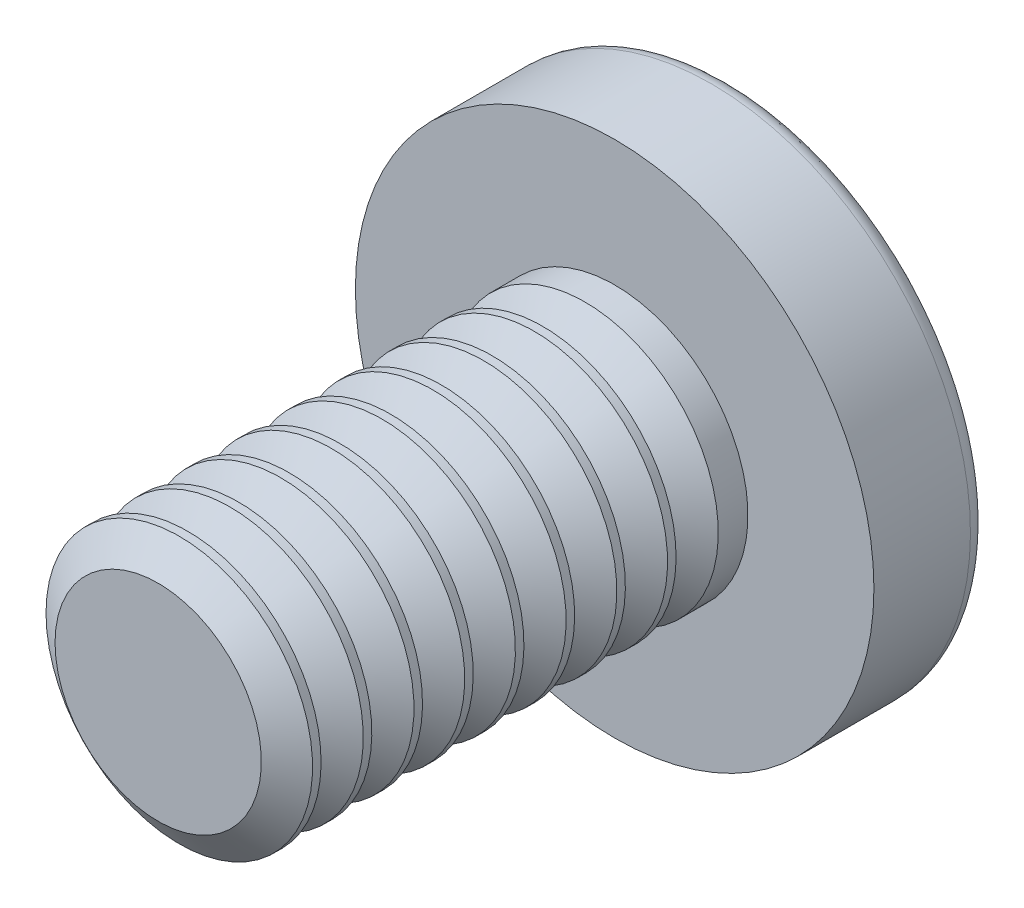
ISO-10303-21;
HEADER;
FILE_DESCRIPTION(('STEP AP214'),'2;1');
FILE_NAME('part.step','',(''),(''),'','','');
FILE_SCHEMA(('AUTOMOTIVE_DESIGN { 1 0 10303 214 1 1 1 1 }'));
ENDSEC;
DATA;
#1=APPLICATION_CONTEXT('core data for automotive mechanical design processes');
#2=APPLICATION_PROTOCOL_DEFINITION('international standard','automotive_design',2000,#1);
#3=PRODUCT_CONTEXT('',#1,'mechanical');
#4=PRODUCT('Part','Part','',(#3));
#5=PRODUCT_RELATED_PRODUCT_CATEGORY('part','',(#4));
#6=PRODUCT_DEFINITION_FORMATION('','',#4);
#7=PRODUCT_DEFINITION_CONTEXT('part definition',#1,'design');
#8=PRODUCT_DEFINITION('design','',#6,#7);
#9=PRODUCT_DEFINITION_SHAPE('','',#8);
#10=(LENGTH_UNIT() NAMED_UNIT(*) SI_UNIT(.MILLI.,.METRE.));
#11=(NAMED_UNIT(*) PLANE_ANGLE_UNIT() SI_UNIT($,.RADIAN.));
#12=(NAMED_UNIT(*) SI_UNIT($,.STERADIAN.) SOLID_ANGLE_UNIT());
#13=UNCERTAINTY_MEASURE_WITH_UNIT(LENGTH_MEASURE(1.E-05),#10,'distance_accuracy_value','');
#14=(GEOMETRIC_REPRESENTATION_CONTEXT(3) GLOBAL_UNCERTAINTY_ASSIGNED_CONTEXT((#13)) GLOBAL_UNIT_ASSIGNED_CONTEXT((#10,
#11,#12)) REPRESENTATION_CONTEXT('',''));
#15=CARTESIAN_POINT('',(0.,0.,0.));
#16=DIRECTION('',(0.,0.,1.));
#17=DIRECTION('',(1.,0.,0.));
#18=AXIS2_PLACEMENT_3D('',#15,#16,#17);
#19=CARTESIAN_POINT('',(15.7814883501429,22.9304884918168,-0.938722603143375));
#20=DIRECTION('',(0.,0.,1.));
#21=DIRECTION('',(1.,0.,0.));
#22=AXIS2_PLACEMENT_3D('',#19,#20,#21);
#23=PLANE('',#22);
#24=CARTESIAN_POINT('',(16.706385111808,22.9943664243214,-0.938722603150306));
#25=DIRECTION('',(0.,0.,-1.));
#26=DIRECTION('',(-1.,0.,0.));
#27=AXIS2_PLACEMENT_3D('',#24,#25,#26);
#28=CIRCLE('',#27,0.717549999978716);
#29=CARTESIAN_POINT('',(15.9888351118293,22.9943664243214,-0.938722603150305));
#30=VERTEX_POINT('',#29);
#31=EDGE_CURVE('E20',#30,#30,#28,.T.);
#32=ORIENTED_EDGE('',*,*,#31,.F.);
#33=EDGE_LOOP('',(#32));
#34=FACE_BOUND('',#33,.T.);
#35=ADVANCED_FACE('F17',(#34),#23,.T.);
#36=CARTESIAN_POINT('',(16.706385111808,22.9943664243214,-1.08545109287661));
#37=DIRECTION('',(0.,0.,-1.));
#38=DIRECTION('',(-1.,0.,0.));
#39=AXIS2_PLACEMENT_3D('',#36,#37,#38);
#40=CONICAL_SURFACE('',#39,0.92710000013191,0.959931088637895);
#41=CARTESIAN_POINT('',(16.7063851118081,22.9943664243214,-1.08545109277522));
#42=DIRECTION('',(0.,0.,-1.));
#43=DIRECTION('',(-1.,0.,0.));
#44=AXIS2_PLACEMENT_3D('',#41,#42,#43);
#45=CIRCLE('',#44,0.9271);
#46=CARTESIAN_POINT('',(15.7792851118081,22.9943664243214,-1.08545109277522));
#47=VERTEX_POINT('',#46);
#48=EDGE_CURVE('E223',#47,#47,#45,.T.);
#49=ORIENTED_EDGE('',*,*,#48,.F.);
#50=EDGE_LOOP('',(#49));
#51=FACE_BOUND('',#50,.T.);
#52=ORIENTED_EDGE('',*,*,#31,.T.);
#53=EDGE_LOOP('',(#52));
#54=FACE_BOUND('',#53,.T.);
#55=ADVANCED_FACE('F767',(#51,#54),#40,.T.);
#56=CARTESIAN_POINT('',(16.706385111808,22.9943664243214,-30.8599226031433));
#57=DIRECTION('',(0.,0.,-1.));
#58=DIRECTION('',(-1.,0.,0.));
#59=AXIS2_PLACEMENT_3D('',#56,#57,#58);
#60=CYLINDRICAL_SURFACE('',#59,0.9271);
#61=CARTESIAN_POINT('',(16.706385111808,22.9943664243214,-1.14473661358261));
#62=DIRECTION('',(0.,0.,1.));
#63=DIRECTION('',(-0.997623515980897,-0.0689008008800587,0.));
#64=AXIS2_PLACEMENT_3D('',#61,#62,#63);
#65=CIRCLE('',#64,0.927100000027563);
#66=CARTESIAN_POINT('',(15.7814883501146,22.9304884918236,-1.14473661358261));
#67=VERTEX_POINT('',#66);
#68=EDGE_CURVE('E220',#67,#67,#65,.F.);
#69=ORIENTED_EDGE('',*,*,#68,.F.);
#70=EDGE_LOOP('',(#69));
#71=FACE_BOUND('',#70,.T.);
#72=ORIENTED_EDGE('',*,*,#48,.T.);
#73=EDGE_LOOP('',(#72));
#74=FACE_BOUND('',#73,.T.);
#75=ADVANCED_FACE('F757',(#71,#74),#60,.T.);
#76=CARTESIAN_POINT('',(16.706385111808,22.9943664243214,-1.14473661358261));
#77=DIRECTION('',(0.,0.,1.));
#78=DIRECTION('',(0.,-1.,0.));
#79=AXIS2_PLACEMENT_3D('',#76,#77,#78);
#80=CONICAL_SURFACE('',#79,0.927100000027563,0.959931088618292);
#81=CARTESIAN_POINT('',(16.706385111808,22.9943664243214,-1.29146510312239));
#82=DIRECTION('',(0.,0.,-1.));
#83=DIRECTION('',(0.997623515980567,0.068900800884834,0.));
#84=AXIS2_PLACEMENT_3D('',#81,#82,#83);
#85=CIRCLE('',#84,0.717550000001558);
#86=CARTESIAN_POINT('',(17.4222298657014,23.0438061939964,-1.29146510312239));
#87=VERTEX_POINT('',#86);
#88=EDGE_CURVE('E217',#87,#87,#85,.T.);
#89=ORIENTED_EDGE('',*,*,#88,.F.);
#90=EDGE_LOOP('',(#89));
#91=FACE_BOUND('',#90,.T.);
#92=ORIENTED_EDGE('',*,*,#68,.T.);
#93=EDGE_LOOP('',(#92));
#94=FACE_BOUND('',#93,.T.);
#95=ADVANCED_FACE('F747',(#91,#94),#80,.T.);
#96=CARTESIAN_POINT('',(16.706385111808,22.9943664243214,-1.4381935928327));
#97=DIRECTION('',(0.,0.,-1.));
#98=DIRECTION('',(-1.,0.,0.));
#99=AXIS2_PLACEMENT_3D('',#96,#97,#98);
#100=CONICAL_SURFACE('',#99,0.927100000131913,0.959931088637895);
#101=ORIENTED_EDGE('',*,*,#88,.T.);
#102=EDGE_LOOP('',(#101));
#103=FACE_BOUND('',#102,.T.);
#104=CARTESIAN_POINT('',(16.7063851118081,22.9943664243214,-1.43819359277522));
#105=DIRECTION('',(0.,0.,-1.));
#106=DIRECTION('',(-1.,0.,0.));
#107=AXIS2_PLACEMENT_3D('',#104,#105,#106);
#108=CIRCLE('',#107,0.9271);
#109=CARTESIAN_POINT('',(15.7792851118081,22.9943664243214,-1.43819359277522));
#110=VERTEX_POINT('',#109);
#111=EDGE_CURVE('E214',#110,#110,#108,.T.);
#112=ORIENTED_EDGE('',*,*,#111,.F.);
#113=EDGE_LOOP('',(#112));
#114=FACE_BOUND('',#113,.T.);
#115=ADVANCED_FACE('F737',(#103,#114),#100,.T.);
#116=CARTESIAN_POINT('',(16.706385111808,22.9943664243214,-30.8599226031433));
#117=DIRECTION('',(0.,0.,-1.));
#118=DIRECTION('',(-1.,0.,0.));
#119=AXIS2_PLACEMENT_3D('',#116,#117,#118);
#120=CYLINDRICAL_SURFACE('',#119,0.9271);
#121=ORIENTED_EDGE('',*,*,#111,.T.);
#122=EDGE_LOOP('',(#121));
#123=FACE_BOUND('',#122,.T.);
#124=CARTESIAN_POINT('',(16.706385111808,22.9943664243214,-1.49747911359555));
#125=DIRECTION('',(0.,0.,1.));
#126=DIRECTION('',(-0.997623515980894,-0.0689008008801036,0.));
#127=AXIS2_PLACEMENT_3D('',#124,#125,#126);
#128=CIRCLE('',#127,0.927100000027615);
#129=CARTESIAN_POINT('',(15.7814883501146,22.9304884918236,-1.49747911359555));
#130=VERTEX_POINT('',#129);
#131=EDGE_CURVE('E211',#130,#130,#128,.F.);
#132=ORIENTED_EDGE('',*,*,#131,.F.);
#133=EDGE_LOOP('',(#132));
#134=FACE_BOUND('',#133,.T.);
#135=ADVANCED_FACE('F727',(#123,#134),#120,.T.);
#136=CARTESIAN_POINT('',(16.706385111808,22.9943664243214,-1.49747911359555));
#137=DIRECTION('',(0.,0.,1.));
#138=DIRECTION('',(0.,-1.,0.));
#139=AXIS2_PLACEMENT_3D('',#136,#137,#138);
#140=CONICAL_SURFACE('',#139,0.927100000027615,0.959931088618292);
#141=ORIENTED_EDGE('',*,*,#131,.T.);
#142=EDGE_LOOP('',(#141));
#143=FACE_BOUND('',#142,.T.);
#144=CARTESIAN_POINT('',(16.706385111808,22.9943664243214,-1.64420760313533));
#145=DIRECTION('',(0.,0.,-1.));
#146=DIRECTION('',(0.997623515980571,0.0689008008847761,0.));
#147=AXIS2_PLACEMENT_3D('',#144,#145,#146);
#148=CIRCLE('',#147,0.717550000001506);
#149=CARTESIAN_POINT('',(17.4222298657014,23.0438061939964,-1.64420760313533));
#150=VERTEX_POINT('',#149);
#151=EDGE_CURVE('E208',#150,#150,#148,.T.);
#152=ORIENTED_EDGE('',*,*,#151,.F.);
#153=EDGE_LOOP('',(#152));
#154=FACE_BOUND('',#153,.T.);
#155=ADVANCED_FACE('F717',(#143,#154),#140,.T.);
#156=CARTESIAN_POINT('',(16.706385111808,22.9943664243214,-1.7909360927888));
#157=DIRECTION('',(0.,0.,-1.));
#158=DIRECTION('',(-1.,0.,0.));
#159=AXIS2_PLACEMENT_3D('',#156,#157,#158);
#160=CONICAL_SURFACE('',#159,0.927100000017956,0.959931088510746);
#161=CARTESIAN_POINT('',(16.7063851118081,22.9943664243214,-1.79093609277522));
#162=DIRECTION('',(0.,0.,-1.));
#163=DIRECTION('',(-1.,0.,0.));
#164=AXIS2_PLACEMENT_3D('',#161,#162,#163);
#165=CIRCLE('',#164,0.9271);
#166=CARTESIAN_POINT('',(15.7792851118081,22.9943664243214,-1.79093609277522));
#167=VERTEX_POINT('',#166);
#168=EDGE_CURVE('E205',#167,#167,#165,.T.);
#169=ORIENTED_EDGE('',*,*,#168,.F.);
#170=EDGE_LOOP('',(#169));
#171=FACE_BOUND('',#170,.T.);
#172=ORIENTED_EDGE('',*,*,#151,.T.);
#173=EDGE_LOOP('',(#172));
#174=FACE_BOUND('',#173,.T.);
#175=ADVANCED_FACE('F707',(#171,#174),#160,.T.);
#176=CARTESIAN_POINT('',(16.706385111808,22.9943664243214,-30.8599226031433));
#177=DIRECTION('',(0.,0.,-1.));
#178=DIRECTION('',(-1.,0.,0.));
#179=AXIS2_PLACEMENT_3D('',#176,#177,#178);
#180=CYLINDRICAL_SURFACE('',#179,0.9271);
#181=CARTESIAN_POINT('',(16.706385111808,22.9943664243214,-1.8502216134948));
#182=DIRECTION('',(0.,0.,1.));
#183=DIRECTION('',(-0.997623515980606,-0.0689008008842732,0.));
#184=AXIS2_PLACEMENT_3D('',#181,#182,#183);
#185=CIRCLE('',#184,0.927099999970855);
#186=CARTESIAN_POINT('',(15.7814883501715,22.9304884918236,-1.8502216134948));
#187=VERTEX_POINT('',#186);
#188=EDGE_CURVE('E202',#187,#187,#185,.F.);
#189=ORIENTED_EDGE('',*,*,#188,.F.);
#190=EDGE_LOOP('',(#189));
#191=FACE_BOUND('',#190,.T.);
#192=ORIENTED_EDGE('',*,*,#168,.T.);
#193=EDGE_LOOP('',(#192));
#194=FACE_BOUND('',#193,.T.);
#195=ADVANCED_FACE('F697',(#191,#194),#180,.T.);
#196=CARTESIAN_POINT('',(16.706385111808,22.9943664243214,-1.85022161355164));
#197=DIRECTION('',(0.,0.,1.));
#198=DIRECTION('',(0.,-1.,0.));
#199=AXIS2_PLACEMENT_3D('',#196,#197,#198);
#200=CONICAL_SURFACE('',#199,0.927099999856948,0.959931088618292);
#201=CARTESIAN_POINT('',(16.706385111808,22.9943664243214,-1.99695010320511));
#202=DIRECTION('',(0.,0.,-1.));
#203=DIRECTION('',(0.997623515980566,0.0689008008848387,0.));
#204=AXIS2_PLACEMENT_3D('',#201,#202,#203);
#205=CIRCLE('',#204,0.717550000001509);
#206=CARTESIAN_POINT('',(17.4222298657014,23.0438061939964,-1.99695010320511));
#207=VERTEX_POINT('',#206);
#208=EDGE_CURVE('E199',#207,#207,#205,.T.);
#209=ORIENTED_EDGE('',*,*,#208,.F.);
#210=EDGE_LOOP('',(#209));
#211=FACE_BOUND('',#210,.T.);
#212=ORIENTED_EDGE('',*,*,#188,.T.);
#213=EDGE_LOOP('',(#212));
#214=FACE_BOUND('',#213,.T.);
#215=ADVANCED_FACE('F687',(#211,#214),#200,.T.);
#216=CARTESIAN_POINT('',(16.706385111808,22.9943664243214,-2.1436785926312));
#217=DIRECTION('',(0.,0.,-1.));
#218=DIRECTION('',(0.,1.,0.));
#219=AXIS2_PLACEMENT_3D('',#216,#217,#218);
#220=CONICAL_SURFACE('',#219,0.927099999733438,0.959931088491143);
#221=ORIENTED_EDGE('',*,*,#208,.T.);
#222=EDGE_LOOP('',(#221));
#223=FACE_BOUND('',#222,.T.);
#224=CARTESIAN_POINT('',(16.7063851118081,22.9943664243214,-2.14367859277522));
#225=DIRECTION('',(0.,0.,-1.));
#226=DIRECTION('',(-1.,0.,0.));
#227=AXIS2_PLACEMENT_3D('',#224,#225,#226);
#228=CIRCLE('',#227,0.9271);
#229=CARTESIAN_POINT('',(15.7792851118081,22.9943664243214,-2.14367859277522));
#230=VERTEX_POINT('',#229);
#231=EDGE_CURVE('E196',#230,#230,#228,.T.);
#232=ORIENTED_EDGE('',*,*,#231,.F.);
#233=EDGE_LOOP('',(#232));
#234=FACE_BOUND('',#233,.T.);
#235=ADVANCED_FACE('F677',(#223,#234),#220,.T.);
#236=CARTESIAN_POINT('',(16.706385111808,22.9943664243214,-30.8599226031433));
#237=DIRECTION('',(0.,0.,-1.));
#238=DIRECTION('',(-1.,0.,0.));
#239=AXIS2_PLACEMENT_3D('',#236,#237,#238);
#240=CYLINDRICAL_SURFACE('',#239,0.9271);
#241=ORIENTED_EDGE('',*,*,#231,.T.);
#242=EDGE_LOOP('',(#241));
#243=FACE_BOUND('',#242,.T.);
#244=CARTESIAN_POINT('',(16.706385111808,22.9943664243214,-2.20296411356458));
#245=DIRECTION('',(0.,0.,1.));
#246=DIRECTION('',(-0.997623515980606,-0.0689008008842696,0.));
#247=AXIS2_PLACEMENT_3D('',#244,#245,#246);
#248=CIRCLE('',#247,0.927099999970903);
#249=CARTESIAN_POINT('',(15.7814883501715,22.9304884918236,-2.20296411356458));
#250=VERTEX_POINT('',#249);
#251=EDGE_CURVE('E193',#250,#250,#248,.F.);
#252=ORIENTED_EDGE('',*,*,#251,.F.);
#253=EDGE_LOOP('',(#252));
#254=FACE_BOUND('',#253,.T.);
#255=ADVANCED_FACE('F667',(#243,#254),#240,.T.);
#256=CARTESIAN_POINT('',(16.706385111808,22.9943664243214,-2.20296411367826));
#257=DIRECTION('',(0.,0.,1.));
#258=DIRECTION('',(0.,-1.,0.));
#259=AXIS2_PLACEMENT_3D('',#256,#257,#258);
#260=CONICAL_SURFACE('',#259,0.927099999799799,0.959931088544916);
#261=ORIENTED_EDGE('',*,*,#251,.T.);
#262=EDGE_LOOP('',(#261));
#263=FACE_BOUND('',#262,.T.);
#264=CARTESIAN_POINT('',(16.706385111808,22.9943664243213,-2.34969260321805));
#265=DIRECTION('',(0.,0.,-1.));
#266=DIRECTION('',(0.997623515980562,0.068900800884911,0.));
#267=AXIS2_PLACEMENT_3D('',#264,#265,#266);
#268=CIRCLE('',#267,0.717550000001561);
#269=CARTESIAN_POINT('',(17.4222298657014,23.0438061939964,-2.34969260321805));
#270=VERTEX_POINT('',#269);
#271=EDGE_CURVE('E190',#270,#270,#268,.T.);
#272=ORIENTED_EDGE('',*,*,#271,.F.);
#273=EDGE_LOOP('',(#272));
#274=FACE_BOUND('',#273,.T.);
#275=ADVANCED_FACE('F657',(#263,#274),#260,.T.);
#276=CARTESIAN_POINT('',(16.706385111808,22.9943664243213,-2.49642109264414));
#277=DIRECTION('',(0.,0.,-1.));
#278=DIRECTION('',(0.,1.,0.));
#279=AXIS2_PLACEMENT_3D('',#276,#277,#278);
#280=CONICAL_SURFACE('',#279,0.92709999973349,0.959931088491143);
#281=CARTESIAN_POINT('',(16.7063851118081,22.9943664243214,-2.49642109277522));
#282=DIRECTION('',(0.,0.,-1.));
#283=DIRECTION('',(-1.,0.,0.));
#284=AXIS2_PLACEMENT_3D('',#281,#282,#283);
#285=CIRCLE('',#284,0.9271);
#286=CARTESIAN_POINT('',(15.7792851118081,22.9943664243214,-2.49642109277522));
#287=VERTEX_POINT('',#286);
#288=EDGE_CURVE('E187',#287,#287,#285,.T.);
#289=ORIENTED_EDGE('',*,*,#288,.F.);
#290=EDGE_LOOP('',(#289));
#291=FACE_BOUND('',#290,.T.);
#292=ORIENTED_EDGE('',*,*,#271,.T.);
#293=EDGE_LOOP('',(#292));
#294=FACE_BOUND('',#293,.T.);
#295=ADVANCED_FACE('F647',(#291,#294),#280,.T.);
#296=CARTESIAN_POINT('',(16.706385111808,22.9943664243214,-30.8599226031433));
#297=DIRECTION('',(0.,0.,-1.));
#298=DIRECTION('',(-1.,0.,0.));
#299=AXIS2_PLACEMENT_3D('',#296,#297,#298);
#300=CYLINDRICAL_SURFACE('',#299,0.9271);
#301=CARTESIAN_POINT('',(16.706385111808,22.9943664243213,-2.55570661357751));
#302=DIRECTION('',(0.,0.,1.));
#303=DIRECTION('',(-0.99762351598061,-0.0689008008842136,0.));
#304=AXIS2_PLACEMENT_3D('',#301,#302,#303);
#305=CIRCLE('',#304,0.927099999970851);
#306=CARTESIAN_POINT('',(15.7814883501715,22.9304884918236,-2.55570661357751));
#307=VERTEX_POINT('',#306);
#308=EDGE_CURVE('E184',#307,#307,#305,.F.);
#309=ORIENTED_EDGE('',*,*,#308,.F.);
#310=EDGE_LOOP('',(#309));
#311=FACE_BOUND('',#310,.T.);
#312=ORIENTED_EDGE('',*,*,#288,.T.);
#313=EDGE_LOOP('',(#312));
#314=FACE_BOUND('',#313,.T.);
#315=ADVANCED_FACE('F637',(#311,#314),#300,.T.);
#316=CARTESIAN_POINT('',(16.706385111808,22.9943664243213,-2.5557066136912));
#317=DIRECTION('',(0.,0.,1.));
#318=DIRECTION('',(0.,-1.,0.));
#319=AXIS2_PLACEMENT_3D('',#316,#317,#318);
#320=CONICAL_SURFACE('',#319,0.927099999799747,0.959931088544917);
#321=CARTESIAN_POINT('',(16.706385111808,22.9943664243214,-2.7024351031173));
#322=DIRECTION('',(0.,0.,-1.));
#323=DIRECTION('',(0.997623515980567,0.068900800884834,0.));
#324=AXIS2_PLACEMENT_3D('',#321,#322,#323);
#325=CIRCLE('',#324,0.717550000001558);
#326=CARTESIAN_POINT('',(17.4222298657014,23.0438061939964,-2.7024351031173));
#327=VERTEX_POINT('',#326);
#328=EDGE_CURVE('E181',#327,#327,#325,.T.);
#329=ORIENTED_EDGE('',*,*,#328,.F.);
#330=EDGE_LOOP('',(#329));
#331=FACE_BOUND('',#330,.T.);
#332=ORIENTED_EDGE('',*,*,#308,.T.);
#333=EDGE_LOOP('',(#332));
#334=FACE_BOUND('',#333,.T.);
#335=ADVANCED_FACE('F627',(#331,#334),#320,.T.);
#336=CARTESIAN_POINT('',(16.706385111808,22.9943664243214,-2.84916359282761));
#337=DIRECTION('',(0.,0.,-1.));
#338=DIRECTION('',(0.,1.,0.));
#339=AXIS2_PLACEMENT_3D('',#336,#337,#338);
#340=CONICAL_SURFACE('',#339,0.927100000131913,0.959931088637895);
#341=ORIENTED_EDGE('',*,*,#328,.T.);
#342=EDGE_LOOP('',(#341));
#343=FACE_BOUND('',#342,.T.);
#344=CARTESIAN_POINT('',(16.7063851118081,22.9943664243214,-2.84916359277522));
#345=DIRECTION('',(0.,0.,-1.));
#346=DIRECTION('',(-1.,0.,0.));
#347=AXIS2_PLACEMENT_3D('',#344,#345,#346);
#348=CIRCLE('',#347,0.9271);
#349=CARTESIAN_POINT('',(15.7792851118081,22.9943664243214,-2.84916359277522));
#350=VERTEX_POINT('',#349);
#351=EDGE_CURVE('E178',#350,#350,#348,.T.);
#352=ORIENTED_EDGE('',*,*,#351,.F.);
#353=EDGE_LOOP('',(#352));
#354=FACE_BOUND('',#353,.T.);
#355=ADVANCED_FACE('F617',(#343,#354),#340,.T.);
#356=CARTESIAN_POINT('',(16.706385111808,22.9943664243214,-30.8599226031433));
#357=DIRECTION('',(0.,0.,-1.));
#358=DIRECTION('',(-1.,0.,0.));
#359=AXIS2_PLACEMENT_3D('',#356,#357,#358);
#360=CYLINDRICAL_SURFACE('',#359,0.9271);
#361=ORIENTED_EDGE('',*,*,#351,.T.);
#362=EDGE_LOOP('',(#361));
#363=FACE_BOUND('',#362,.T.);
#364=CARTESIAN_POINT('',(16.706385111808,22.9943664243213,-2.90844911353361));
#365=DIRECTION('',(0.,0.,1.));
#366=DIRECTION('',(-0.997623515981192,-0.0689008008757847,0.));
#367=AXIS2_PLACEMENT_3D('',#364,#365,#366);
#368=CIRCLE('',#367,0.927100000084268);
#369=CARTESIAN_POINT('',(15.7814883500578,22.9304884918236,-2.90844911353361));
#370=VERTEX_POINT('',#369);
#371=EDGE_CURVE('E175',#370,#370,#368,.F.);
#372=ORIENTED_EDGE('',*,*,#371,.F.);
#373=EDGE_LOOP('',(#372));
#374=FACE_BOUND('',#373,.T.);
#375=ADVANCED_FACE('F607',(#363,#374),#360,.T.);
#376=CARTESIAN_POINT('',(16.706385111808,22.9943664243213,-2.90844911364729));
#377=DIRECTION('',(0.,0.,1.));
#378=DIRECTION('',(0.,-1.,0.));
#379=AXIS2_PLACEMENT_3D('',#376,#377,#378);
#380=CONICAL_SURFACE('',#379,0.927099999856945,0.959931088491143);
#381=ORIENTED_EDGE('',*,*,#371,.T.);
#382=EDGE_LOOP('',(#381));
#383=FACE_BOUND('',#382,.T.);
#384=CARTESIAN_POINT('',(16.706385111808,22.9943664243214,-3.05517760313023));
#385=DIRECTION('',(0.,0.,-1.));
#386=DIRECTION('',(0.997623515980566,0.0689008008848387,0.));
#387=AXIS2_PLACEMENT_3D('',#384,#385,#386);
#388=CIRCLE('',#387,0.717550000001509);
#389=CARTESIAN_POINT('',(17.4222298657014,23.0438061939964,-3.05517760313023));
#390=VERTEX_POINT('',#389);
#391=EDGE_CURVE('E172',#390,#390,#388,.T.);
#392=ORIENTED_EDGE('',*,*,#391,.F.);
#393=EDGE_LOOP('',(#392));
#394=FACE_BOUND('',#393,.T.);
#395=ADVANCED_FACE('F597',(#383,#394),#380,.T.);
#396=CARTESIAN_POINT('',(16.706385111808,22.9943664243214,-3.2019060927837));
#397=DIRECTION('',(0.,0.,-1.));
#398=DIRECTION('',(0.,1.,0.));
#399=AXIS2_PLACEMENT_3D('',#396,#397,#398);
#400=CONICAL_SURFACE('',#399,0.927100000017959,0.959931088564519);
#401=CARTESIAN_POINT('',(16.7063851118081,22.9943664243214,-3.20190609277522));
#402=DIRECTION('',(0.,0.,-1.));
#403=DIRECTION('',(-1.,0.,0.));
#404=AXIS2_PLACEMENT_3D('',#401,#402,#403);
#405=CIRCLE('',#404,0.9271);
#406=CARTESIAN_POINT('',(15.7792851118081,22.9943664243214,-3.20190609277522));
#407=VERTEX_POINT('',#406);
#408=EDGE_CURVE('E164',#407,#407,#405,.T.);
#409=ORIENTED_EDGE('',*,*,#408,.F.);
#410=EDGE_LOOP('',(#409));
#411=FACE_BOUND('',#410,.T.);
#412=ORIENTED_EDGE('',*,*,#391,.T.);
#413=EDGE_LOOP('',(#412));
#414=FACE_BOUND('',#413,.T.);
#415=ADVANCED_FACE('F587',(#411,#414),#400,.T.);
#416=CARTESIAN_POINT('',(16.706385111808,22.9943664243214,-30.8599226031433));
#417=DIRECTION('',(0.,0.,-1.));
#418=DIRECTION('',(-1.,0.,0.));
#419=AXIS2_PLACEMENT_3D('',#416,#417,#418);
#420=CYLINDRICAL_SURFACE('',#419,0.9271);
#421=CARTESIAN_POINT('',(16.706385111808,22.9943664243214,-3.2611916134897));
#422=DIRECTION('',(0.,0.,1.));
#423=DIRECTION('',(-0.997623515980606,-0.0689008008842696,0.));
#424=AXIS2_PLACEMENT_3D('',#421,#422,#423);
#425=CIRCLE('',#424,0.927099999970903);
#426=CARTESIAN_POINT('',(15.7814883501715,22.9304884918236,-3.2611916134897));
#427=VERTEX_POINT('',#426);
#428=EDGE_CURVE('E161',#427,#427,#425,.F.);
#429=ORIENTED_EDGE('',*,*,#428,.F.);
#430=EDGE_LOOP('',(#429));
#431=FACE_BOUND('',#430,.T.);
#432=ORIENTED_EDGE('',*,*,#408,.T.);
#433=EDGE_LOOP('',(#432));
#434=FACE_BOUND('',#433,.T.);
#435=ADVANCED_FACE('F577',(#431,#434),#420,.T.);
#436=CARTESIAN_POINT('',(16.706385111808,22.9943664243214,-3.26119161366023));
#437=DIRECTION('',(0.,0.,1.));
#438=DIRECTION('',(0.,-1.,0.));
#439=AXIS2_PLACEMENT_3D('',#436,#437,#438);
#440=CONICAL_SURFACE('',#439,0.927099999743091,0.959931088726938);
#441=CARTESIAN_POINT('',(16.706385111808,22.9943664243214,-3.40792010314317));
#442=DIRECTION('',(0.,0.,-1.));
#443=DIRECTION('',(0.997623515980567,0.068900800884834,0.));
#444=AXIS2_PLACEMENT_3D('',#441,#442,#443);
#445=CIRCLE('',#444,0.717550000001558);
#446=CARTESIAN_POINT('',(17.4222298657014,23.0438061939964,-3.40792010314317));
#447=VERTEX_POINT('',#446);
#448=EDGE_CURVE('E157',#447,#447,#445,.T.);
#449=ORIENTED_EDGE('',*,*,#448,.F.);
#450=EDGE_LOOP('',(#449));
#451=FACE_BOUND('',#450,.T.);
#452=ORIENTED_EDGE('',*,*,#428,.T.);
#453=EDGE_LOOP('',(#452));
#454=FACE_BOUND('',#453,.T.);
#455=ADVANCED_FACE('F567',(#451,#454),#440,.T.);
#456=CARTESIAN_POINT('',(16.706385111808,22.9943664243214,-3.55464859285348));
#457=DIRECTION('',(0.,0.,-1.));
#458=DIRECTION('',(0.,1.,0.));
#459=AXIS2_PLACEMENT_3D('',#456,#457,#458);
#460=CONICAL_SURFACE('',#459,0.927100000131913,0.959931088637895);
#461=ORIENTED_EDGE('',*,*,#448,.T.);
#462=EDGE_LOOP('',(#461));
#463=FACE_BOUND('',#462,.T.);
#464=CARTESIAN_POINT('',(16.7063851118081,22.9943664243214,-3.55464859277523));
#465=DIRECTION('',(0.,0.,-1.));
#466=DIRECTION('',(-1.,0.,0.));
#467=AXIS2_PLACEMENT_3D('',#464,#465,#466);
#468=CIRCLE('',#467,0.9271);
#469=CARTESIAN_POINT('',(15.7792851118081,22.9943664243214,-3.55464859277522));
#470=VERTEX_POINT('',#469);
#471=EDGE_CURVE('E122',#470,#470,#468,.T.);
#472=ORIENTED_EDGE('',*,*,#471,.F.);
#473=EDGE_LOOP('',(#472));
#474=FACE_BOUND('',#473,.T.);
#475=ADVANCED_FACE('F558',(#463,#474),#460,.T.);
#476=CARTESIAN_POINT('',(16.5438468059171,23.1359037661011,-4.29152260314338));
#477=DIRECTION('',(0.,0.,-1.));
#478=DIRECTION('',(-1.,0.,0.));
#479=AXIS2_PLACEMENT_3D('',#476,#477,#478);
#480=PLANE('',#479);
#481=DIRECTION('',(-0.997623515980251,-0.0689008008894087,0.));
#482=VECTOR('',#481,1.);
#483=CARTESIAN_POINT('',(16.868923417699,22.8528290825415,-4.29152260314338));
#484=LINE('',#483,#482);
#485=CARTESIAN_POINT('',(16.868923417699,22.8528290825415,-4.29152260314338));
#486=VERTEX_POINT('',#485);
#487=CARTESIAN_POINT('',(16.5648477700281,22.8318281184304,-4.29152260314338));
#488=VERTEX_POINT('',#487);
#489=EDGE_CURVE('E96',#486,#488,#484,.T.);
#490=ORIENTED_EDGE('',*,*,#489,.T.);
#491=DIRECTION('',(-0.068900800889286,0.997623515980259,1.36592399683209E-13));
#492=VECTOR('',#491,1.);
#493=CARTESIAN_POINT('',(16.5648477700281,22.8318281184304,-4.29152260314338));
#494=LINE('',#493,#492);
#495=CARTESIAN_POINT('',(16.5438468059171,23.1359037661012,-4.29152260314336));
#496=VERTEX_POINT('',#495);
#497=EDGE_CURVE('E146',#488,#496,#494,.T.);
#498=ORIENTED_EDGE('',*,*,#497,.T.);
#499=DIRECTION('',(0.997623515980246,0.0689008008894872,-1.02444299762418E-13));
#500=VECTOR('',#499,1.);
#501=CARTESIAN_POINT('',(16.5438468059171,23.1359037661011,-4.29152260314338));
#502=LINE('',#501,#500);
#503=CARTESIAN_POINT('',(16.8479224535879,23.1569047302123,-4.29152260314339));
#504=VERTEX_POINT('',#503);
#505=EDGE_CURVE('E108',#496,#504,#502,.T.);
#506=ORIENTED_EDGE('',*,*,#505,.T.);
#507=DIRECTION('',(0.0689008008894087,-0.997623515980251,0.));
#508=VECTOR('',#507,1.);
#509=CARTESIAN_POINT('',(16.8479224535879,23.1569047302123,-4.29152260314338));
#510=LINE('',#509,#508);
#511=EDGE_CURVE('E129',#504,#486,#510,.T.);
#512=ORIENTED_EDGE('',*,*,#511,.T.);
#513=EDGE_LOOP('',(#490,#498,#506,#512));
#514=FACE_BOUND('',#513,.T.);
#515=ADVANCED_FACE('F145',(#514),#480,.T.);
#516=CARTESIAN_POINT('',(16.706385111808,22.9943664243214,-30.8599226031433));
#517=DIRECTION('',(0.,0.,-1.));
#518=DIRECTION('',(-1.,0.,0.));
#519=AXIS2_PLACEMENT_3D('',#516,#517,#518);
#520=CYLINDRICAL_SURFACE('',#519,0.9271);
#521=ORIENTED_EDGE('',*,*,#471,.T.);
#522=EDGE_LOOP('',(#521));
#523=FACE_BOUND('',#522,.T.);
#524=CARTESIAN_POINT('',(16.706385111808,22.9943664243214,-3.61393411355948));
#525=DIRECTION('',(0.,0.,1.));
#526=DIRECTION('',(-0.997623515980606,-0.0689008008842696,0.));
#527=AXIS2_PLACEMENT_3D('',#524,#525,#526);
#528=CIRCLE('',#527,0.927099999970903);
#529=CARTESIAN_POINT('',(15.7814883501715,22.9304884918236,-3.61393411355948));
#530=VERTEX_POINT('',#529);
#531=EDGE_CURVE('E266',#530,#530,#528,.F.);
#532=ORIENTED_EDGE('',*,*,#531,.F.);
#533=EDGE_LOOP('',(#532));
#534=FACE_BOUND('',#533,.T.);
#535=ADVANCED_FACE('F540',(#523,#534),#520,.T.);
#536=CARTESIAN_POINT('',(16.6975210685144,23.1227100418448,-4.10943429145507));
#537=DIRECTION('',(0.0683220624929892,-0.989243888655062,-0.129339184067768));
#538=DIRECTION('',(0.,0.129642116487693,-0.991560851200062));
#539=AXIS2_PLACEMENT_3D('',#536,#537,#538);
#540=PLANE('',#539);
#541=DIRECTION('',(-0.11912794754449,-0.136803860625424,0.983408987060733));
#542=VECTOR('',#541,1.);
#543=CARTESIAN_POINT('',(16.9857460518238,23.3151782563882,-5.42926540764868));
#544=LINE('',#543,#542);
#545=CARTESIAN_POINT('',(16.9857460518239,23.3151782563882,-5.42926540764866));
#546=VERTEX_POINT('',#545);
#547=EDGE_CURVE('E114',#546,#504,#544,.T.);
#548=ORIENTED_EDGE('',*,*,#547,.F.);
#549=CARTESIAN_POINT('',(17.6639550596594,23.3424348079356,-5.27947892714646));
#550=CARTESIAN_POINT('',(17.5537552883186,23.3398118704661,-5.31762939823403));
#551=CARTESIAN_POINT('',(17.4421379853286,23.3362290224358,-5.34918684048634));
#552=CARTESIAN_POINT('',(17.2160683160501,23.3271435052533,-5.3991156673204));
#553=CARTESIAN_POINT('',(17.1016159497617,23.3216408361012,-5.41748705190216));
#554=CARTESIAN_POINT('',(16.985746051824,23.3151782563882,-5.42926540764864));
#555=B_SPLINE_CURVE_WITH_KNOTS('',3,(#549,#550,#551,#552,#553,#554),.UNSPECIFIED.,.F.,.F.,(4,2,
4),(0.,0.348143909316977,0.696287818633958),.UNSPECIFIED.);
#556=CARTESIAN_POINT('',(17.6639550596594,23.3424348079356,-5.27947892714645));
#557=VERTEX_POINT('',#556);
#558=EDGE_CURVE('E80',#557,#546,#555,.T.);
#559=ORIENTED_EDGE('',*,*,#558,.F.);
#560=DIRECTION('',(-0.63026065827348,-0.143293672391737,0.763045494112356));
#561=VECTOR('',#560,1.);
#562=CARTESIAN_POINT('',(17.6639550596594,23.3424348079356,-5.27947892714644));
#563=LINE('',#562,#561);
#564=EDGE_CURVE('E124',#557,#504,#563,.T.);
#565=ORIENTED_EDGE('',*,*,#564,.T.);
#566=EDGE_LOOP('',(#548,#559,#565));
#567=FACE_BOUND('',#566,.T.);
#568=ADVANCED_FACE('F126',(#567),#540,.T.);
#569=CARTESIAN_POINT('',(16.8347287293314,23.003230467615,-4.10943429145507));
#570=DIRECTION('',(-0.989243888655062,-0.0683220624929927,-0.129339184067766));
#571=DIRECTION('',(-0.129642116487691,0.,0.991560851200062));
#572=AXIS2_PLACEMENT_3D('',#569,#570,#571);
#573=PLANE('',#572);
#574=ORIENTED_EDGE('',*,*,#547,.T.);
#575=DIRECTION('',(0.0552886220488638,0.643975731054184,-0.763045494112354));
#576=VECTOR('',#575,1.);
#577=CARTESIAN_POINT('',(16.8479224535879,23.1569047302123,-4.29152260314341));
#578=LINE('',#577,#576);
#579=CARTESIAN_POINT('',(16.9195076267133,23.9906949837536,-5.27947892714647));
#580=VERTEX_POINT('',#579);
#581=EDGE_CURVE('E117',#504,#580,#578,.T.);
#582=ORIENTED_EDGE('',*,*,#581,.T.);
#583=CARTESIAN_POINT('',(16.9857460518238,23.3151782563882,-5.42926540764866));
#584=CARTESIAN_POINT('',(16.9762181595876,23.4308364487231,-5.41748705190218));
#585=CARTESIAN_POINT('',(16.9659343447103,23.5449586055043,-5.39911566732042));
#586=CARTESIAN_POINT('',(16.9438548696735,23.7701308479595,-5.34918684048635));
#587=CARTESIAN_POINT('',(16.9320592095139,23.8811809336334,-5.31762939823405));
#588=CARTESIAN_POINT('',(16.9195076267133,23.9906949837536,-5.27947892714646));
#589=B_SPLINE_CURVE_WITH_KNOTS('',3,(#583,#584,#585,#586,#587,#588),.UNSPECIFIED.,.F.,.F.,(4,2,
4),(0.,0.348143909317065,0.696287818634133),.UNSPECIFIED.);
#590=EDGE_CURVE('E119',#546,#580,#589,.T.);
#591=ORIENTED_EDGE('',*,*,#590,.F.);
#592=EDGE_LOOP('',(#574,#582,#591));
#593=FACE_BOUND('',#592,.T.);
#594=ADVANCED_FACE('F116',(#593),#573,.T.);
#595=CARTESIAN_POINT('',(16.5438468059171,23.1359037661011,-4.29152260314338));
#596=DIRECTION('',(-0.0528367911852505,0.765030663140677,0.641822684198511));
#597=DIRECTION('',(0.,-0.642720461095879,0.766100782461878));
#598=AXIS2_PLACEMENT_3D('',#595,#596,#597);
#599=PLANE('',#598);
#600=ORIENTED_EDGE('',*,*,#505,.F.);
#601=DIRECTION('',(0.143293672391785,-0.630260658273476,0.76304549411235));
#602=VECTOR('',#601,1.);
#603=CARTESIAN_POINT('',(16.3583167281937,23.9519363721726,-5.27947892714644));
#604=LINE('',#603,#602);
#605=CARTESIAN_POINT('',(16.3583167281938,23.9519363721727,-5.27947892714646));
#606=VERTEX_POINT('',#605);
#607=EDGE_CURVE('E142',#606,#496,#604,.T.);
#608=ORIENTED_EDGE('',*,*,#607,.F.);
#609=CARTESIAN_POINT('',(16.9195076267133,23.9906949837535,-5.27947892714647));
#610=CARTESIAN_POINT('',(16.825555178046,23.9903256033118,-5.2867730890116));
#611=CARTESIAN_POINT('',(16.7318130455023,23.9869110287925,-5.29042016994417));
#612=CARTESIAN_POINT('',(16.5447494126625,23.9739914915988,-5.29042016994416));
#613=CARTESIAN_POINT('',(16.4514279123663,23.9644865289245,-5.2867730890116));
#614=CARTESIAN_POINT('',(16.3583167281938,23.9519363721727,-5.27947892714647));
#615=B_SPLINE_CURVE_WITH_KNOTS('',3,(#609,#610,#611,#612,#613,#614),.UNSPECIFIED.,.F.,.F.,(4,2,
4),(0.,0.281625516228102,0.563251032456202),.UNSPECIFIED.);
#616=EDGE_CURVE('E140',#580,#606,#615,.T.);
#617=ORIENTED_EDGE('',*,*,#616,.F.);
#618=ORIENTED_EDGE('',*,*,#581,.F.);
#619=EDGE_LOOP('',(#600,#608,#617,#618));
#620=FACE_BOUND('',#619,.T.);
#621=ADVANCED_FACE('F139',(#620),#599,.F.);
#622=CARTESIAN_POINT('',(16.5780414942846,22.9855023810278,-4.10943429145507));
#623=DIRECTION('',(0.989243888655061,0.0683220624929924,-0.129339184067768));
#624=DIRECTION('',(-0.129642116487693,0.,-0.991560851200062));
#625=AXIS2_PLACEMENT_3D('',#622,#623,#624);
#626=PLANE('',#625);
#627=ORIENTED_EDGE('',*,*,#607,.T.);
#628=DIRECTION('',(0.136803860625461,-0.119127947544488,0.983408987060728));
#629=VECTOR('',#628,1.);
#630=CARTESIAN_POINT('',(16.3855732797413,23.2737273643371,-5.42926540764869));
#631=LINE('',#630,#629);
#632=CARTESIAN_POINT('',(16.3855732797412,23.2737273643371,-5.42926540764867));
#633=VERTEX_POINT('',#632);
#634=EDGE_CURVE('E310',#633,#496,#631,.T.);
#635=ORIENTED_EDGE('',*,*,#634,.F.);
#636=CARTESIAN_POINT('',(16.3583167281937,23.9519363721727,-5.27947892714647));
#637=CARTESIAN_POINT('',(16.3609396656632,23.8417366008319,-5.31762939823405));
#638=CARTESIAN_POINT('',(16.3645225136935,23.7301192978418,-5.34918684048635));
#639=CARTESIAN_POINT('',(16.373608030876,23.5040496285633,-5.39911566732041));
#640=CARTESIAN_POINT('',(16.3791107000282,23.3895972622749,-5.41748705190217));
#641=CARTESIAN_POINT('',(16.3855732797412,23.2737273643371,-5.42926540764865));
#642=B_SPLINE_CURVE_WITH_KNOTS('',3,(#636,#637,#638,#639,#640,#641),.UNSPECIFIED.,.F.,.F.,(4,2,
4),(0.,0.348143909317025,0.696287818634053),.UNSPECIFIED.);
#643=EDGE_CURVE('E894',#606,#633,#642,.T.);
#644=ORIENTED_EDGE('',*,*,#643,.F.);
#645=EDGE_LOOP('',(#627,#635,#644));
#646=FACE_BOUND('',#645,.T.);
#647=ADVANCED_FACE('F505',(#646),#626,.T.);
#648=CARTESIAN_POINT('',(16.6975210685144,23.1227100418448,-4.10943429145507));
#649=DIRECTION('',(0.0683220624929892,-0.989243888655062,-0.129339184067768));
#650=DIRECTION('',(0.,0.129642116487693,-0.991560851200062));
#651=AXIS2_PLACEMENT_3D('',#648,#649,#650);
#652=PLANE('',#651);
#653=ORIENTED_EDGE('',*,*,#634,.T.);
#654=DIRECTION('',(-0.643975731054185,0.0552886220488649,-0.763045494112354));
#655=VECTOR('',#654,1.);
#656=CARTESIAN_POINT('',(16.5438468059171,23.1359037661011,-4.29152260314333));
#657=LINE('',#656,#655);
#658=CARTESIAN_POINT('',(15.7100565523758,23.2074889392266,-5.27947892714644));
#659=VERTEX_POINT('',#658);
#660=EDGE_CURVE('E302',#496,#659,#657,.T.);
#661=ORIENTED_EDGE('',*,*,#660,.T.);
#662=CARTESIAN_POINT('',(16.3855732797412,23.2737273643371,-5.42926540764866));
#663=CARTESIAN_POINT('',(16.2699150874063,23.2641994721009,-5.41748705190218));
#664=CARTESIAN_POINT('',(16.1557929306251,23.2539156572236,-5.39911566732042));
#665=CARTESIAN_POINT('',(15.9306206881699,23.2318361821868,-5.34918684048635));
#666=CARTESIAN_POINT('',(15.819570602496,23.2200405220273,-5.31762939823403));
#667=CARTESIAN_POINT('',(15.7100565523758,23.2074889392266,-5.27947892714645));
#668=B_SPLINE_CURVE_WITH_KNOTS('',3,(#662,#663,#664,#665,#666,#667),.UNSPECIFIED.,.F.,.F.,(4,2,
4),(0.,0.348143909317084,0.69628781863417),.UNSPECIFIED.);
#669=EDGE_CURVE('E904',#633,#659,#668,.T.);
#670=ORIENTED_EDGE('',*,*,#669,.F.);
#671=EDGE_LOOP('',(#653,#661,#670));
#672=FACE_BOUND('',#671,.T.);
#673=ADVANCED_FACE('F495',(#672),#652,.T.);
#674=CARTESIAN_POINT('',(16.5648477700281,22.8318281184304,-4.29152260314338));
#675=DIRECTION('',(-0.765030663140678,-0.0528367911852481,0.64182268419851));
#676=DIRECTION('',(0.642720461095878,0.,0.766100782461878));
#677=AXIS2_PLACEMENT_3D('',#674,#675,#676);
#678=PLANE('',#677);
#679=ORIENTED_EDGE('',*,*,#497,.F.);
#680=DIRECTION('',(0.630260658273394,0.143293672391785,0.763045494112418));
#681=VECTOR('',#680,1.);
#682=CARTESIAN_POINT('',(15.7488151639568,22.6462980407071,-5.27947892714648));
#683=LINE('',#682,#681);
#684=CARTESIAN_POINT('',(15.7488151639567,22.6462980407071,-5.27947892714646));
#685=VERTEX_POINT('',#684);
#686=EDGE_CURVE('E296',#685,#488,#683,.T.);
#687=ORIENTED_EDGE('',*,*,#686,.F.);
#688=CARTESIAN_POINT('',(15.7100565523758,23.2074889392266,-5.27947892714645));
#689=CARTESIAN_POINT('',(15.7104259328177,23.1135364905593,-5.28677308901134));
#690=CARTESIAN_POINT('',(15.7138405073371,23.0197943580157,-5.29042016994379));
#691=CARTESIAN_POINT('',(15.7267600445308,22.8327307251758,-5.29042016994379));
#692=CARTESIAN_POINT('',(15.736265007205,22.7394092248796,-5.28677308901134));
#693=CARTESIAN_POINT('',(15.7488151639567,22.6462980407071,-5.27947892714644));
#694=B_SPLINE_CURVE_WITH_KNOTS('',3,(#688,#689,#690,#691,#692,#693),.UNSPECIFIED.,.F.,.F.,(4,2,
4),(0.,0.281625516228013,0.563251032456137),.UNSPECIFIED.);
#695=EDGE_CURVE('E912',#659,#685,#694,.T.);
#696=ORIENTED_EDGE('',*,*,#695,.F.);
#697=ORIENTED_EDGE('',*,*,#660,.F.);
#698=EDGE_LOOP('',(#679,#687,#696,#697));
#699=FACE_BOUND('',#698,.T.);
#700=ADVANCED_FACE('F485',(#699),#678,.F.);
#701=CARTESIAN_POINT('',(16.7152491551017,22.866022806798,-4.10943429145507));
#702=DIRECTION('',(-0.0683220624929891,0.989243888655062,-0.129339184067766));
#703=DIRECTION('',(0.,0.129642116487691,0.991560851200062));
#704=AXIS2_PLACEMENT_3D('',#701,#702,#703);
#705=PLANE('',#704);
#706=DIRECTION('',(0.119127947544493,0.136803860625433,0.983408987060731));
#707=VECTOR('',#706,1.);
#708=CARTESIAN_POINT('',(16.4270241717922,22.6735545922545,-5.42926540764865));
#709=LINE('',#708,#707);
#710=CARTESIAN_POINT('',(16.4270241717922,22.6735545922545,-5.42926540764865));
#711=VERTEX_POINT('',#710);
#712=EDGE_CURVE('E292',#711,#488,#709,.T.);
#713=ORIENTED_EDGE('',*,*,#712,.F.);
#714=CARTESIAN_POINT('',(15.7488151639568,22.6462980407071,-5.27947892714648));
#715=CARTESIAN_POINT('',(15.8590149352975,22.6489209781766,-5.31762939823405));
#716=CARTESIAN_POINT('',(15.9706322382875,22.6525038262069,-5.34918684048635));
#717=CARTESIAN_POINT('',(16.196701907566,22.6615893433894,-5.3991156673204));
#718=CARTESIAN_POINT('',(16.3111542738544,22.6670920125415,-5.41748705190215));
#719=CARTESIAN_POINT('',(16.4270241717921,22.6735545922545,-5.42926540764864));
#720=B_SPLINE_CURVE_WITH_KNOTS('',3,(#714,#715,#716,#717,#718,#719),.UNSPECIFIED.,.F.,.F.,(4,2,
4),(0.,0.348143909316932,0.696287818633863),.UNSPECIFIED.);
#721=EDGE_CURVE('E919',#685,#711,#720,.T.);
#722=ORIENTED_EDGE('',*,*,#721,.F.);
#723=ORIENTED_EDGE('',*,*,#686,.T.);
#724=EDGE_LOOP('',(#713,#722,#723));
#725=FACE_BOUND('',#724,.T.);
#726=ADVANCED_FACE('F475',(#725),#705,.T.);
#727=CARTESIAN_POINT('',(16.5780414942846,22.9855023810278,-4.10943429145507));
#728=DIRECTION('',(0.989243888655061,0.0683220624929924,-0.129339184067768));
#729=DIRECTION('',(-0.129642116487693,0.,-0.991560851200062));
#730=AXIS2_PLACEMENT_3D('',#727,#728,#729);
#731=PLANE('',#730);
#732=ORIENTED_EDGE('',*,*,#712,.T.);
#733=DIRECTION('',(-0.0552886220488593,-0.643975731054184,-0.763045494112354));
#734=VECTOR('',#733,1.);
#735=CARTESIAN_POINT('',(16.5648477700281,22.8318281184304,-4.29152260314338));
#736=LINE('',#735,#734);
#737=CARTESIAN_POINT('',(16.4932625969027,21.9980378648891,-5.27947892714644));
#738=VERTEX_POINT('',#737);
#739=EDGE_CURVE('E284',#488,#738,#736,.T.);
#740=ORIENTED_EDGE('',*,*,#739,.T.);
#741=CARTESIAN_POINT('',(16.4270241717922,22.6735545922545,-5.42926540764865));
#742=CARTESIAN_POINT('',(16.4365520640285,22.5578963999196,-5.41748705190217));
#743=CARTESIAN_POINT('',(16.4468358789058,22.4437742431383,-5.39911566732041));
#744=CARTESIAN_POINT('',(16.4689153539426,22.2186020006832,-5.34918684048634));
#745=CARTESIAN_POINT('',(16.4807110141021,22.1075519150093,-5.31762939823403));
#746=CARTESIAN_POINT('',(16.4932625969027,21.9980378648891,-5.27947892714644));
#747=B_SPLINE_CURVE_WITH_KNOTS('',3,(#741,#742,#743,#744,#745,#746),.UNSPECIFIED.,.F.,.F.,(4,2,
4),(0.,0.348143909317062,0.696287818634125),.UNSPECIFIED.);
#748=EDGE_CURVE('E925',#711,#738,#747,.T.);
#749=ORIENTED_EDGE('',*,*,#748,.F.);
#750=EDGE_LOOP('',(#732,#740,#749));
#751=FACE_BOUND('',#750,.T.);
#752=ADVANCED_FACE('F466',(#751),#731,.T.);
#753=CARTESIAN_POINT('',(16.868923417699,22.8528290825415,-4.29152260314338));
#754=DIRECTION('',(0.0528367911852511,-0.765030663140678,0.64182268419851));
#755=DIRECTION('',(0.,-0.642720461095878,-0.766100782461879));
#756=AXIS2_PLACEMENT_3D('',#753,#754,#755);
#757=PLANE('',#756);
#758=ORIENTED_EDGE('',*,*,#489,.F.);
#759=DIRECTION('',(-0.143293672391785,0.63026065827343,0.763045494112388));
#760=VECTOR('',#759,1.);
#761=CARTESIAN_POINT('',(17.0544534954223,22.0367964764701,-5.27947892714644));
#762=LINE('',#761,#760);
#763=CARTESIAN_POINT('',(17.0544534954223,22.03679647647,-5.27947892714644));
#764=VERTEX_POINT('',#763);
#765=EDGE_CURVE('E279',#764,#486,#762,.T.);
#766=ORIENTED_EDGE('',*,*,#765,.F.);
#767=CARTESIAN_POINT('',(16.4932625969028,21.9980378648891,-5.27947892714644));
#768=CARTESIAN_POINT('',(16.5872150455701,21.9984072453308,-5.28677308901157));
#769=CARTESIAN_POINT('',(16.6809571781137,22.0018218198501,-5.29042016994413));
#770=CARTESIAN_POINT('',(16.8680208109536,22.0147413570438,-5.29042016994413));
#771=CARTESIAN_POINT('',(16.9613423112498,22.0242463197181,-5.28677308901157));
#772=CARTESIAN_POINT('',(17.0544534954223,22.03679647647,-5.27947892714645));
#773=B_SPLINE_CURVE_WITH_KNOTS('',3,(#767,#768,#769,#770,#771,#772),.UNSPECIFIED.,.F.,.F.,(4,2,
4),(0.,0.281625516228102,0.563251032456199),.UNSPECIFIED.);
#774=EDGE_CURVE('E935',#738,#764,#773,.T.);
#775=ORIENTED_EDGE('',*,*,#774,.F.);
#776=ORIENTED_EDGE('',*,*,#739,.F.);
#777=EDGE_LOOP('',(#758,#766,#775,#776));
#778=FACE_BOUND('',#777,.T.);
#779=ADVANCED_FACE('F456',(#778),#757,.F.);
#780=CARTESIAN_POINT('',(16.8347287293314,23.003230467615,-4.10943429145507));
#781=DIRECTION('',(-0.989243888655062,-0.0683220624929927,-0.129339184067766));
#782=DIRECTION('',(-0.129642116487691,0.,0.991560851200062));
#783=AXIS2_PLACEMENT_3D('',#780,#781,#782);
#784=PLANE('',#783);
#785=ORIENTED_EDGE('',*,*,#765,.T.);
#786=DIRECTION('',(-0.136803860625424,0.119127947544495,0.983408987060732));
#787=VECTOR('',#786,1.);
#788=CARTESIAN_POINT('',(17.0271969438748,22.7150054843056,-5.42926540764867));
#789=LINE('',#788,#787);
#790=CARTESIAN_POINT('',(17.0271969438749,22.7150054843056,-5.42926540764866));
#791=VERTEX_POINT('',#790);
#792=EDGE_CURVE('E130',#791,#486,#789,.T.);
#793=ORIENTED_EDGE('',*,*,#792,.F.);
#794=CARTESIAN_POINT('',(17.0544534954223,22.03679647647,-5.27947892714646));
#795=CARTESIAN_POINT('',(17.0518305579529,22.1469962478108,-5.31762939823405));
#796=CARTESIAN_POINT('',(17.0482477099225,22.2586135508008,-5.34918684048635));
#797=CARTESIAN_POINT('',(17.03916219274,22.4846832200794,-5.39911566732042));
#798=CARTESIAN_POINT('',(17.0336595235879,22.5991355863678,-5.41748705190218));
#799=CARTESIAN_POINT('',(17.0271969438749,22.7150054843056,-5.42926540764866));
#800=B_SPLINE_CURVE_WITH_KNOTS('',3,(#794,#795,#796,#797,#798,#799),.UNSPECIFIED.,.F.,.F.,(4,2,
4),(0.,0.34814390931703,0.696287818634069),.UNSPECIFIED.);
#801=EDGE_CURVE('E941',#764,#791,#800,.T.);
#802=ORIENTED_EDGE('',*,*,#801,.F.);
#803=EDGE_LOOP('',(#785,#793,#802));
#804=FACE_BOUND('',#803,.T.);
#805=ADVANCED_FACE('F447',(#804),#784,.T.);
#806=CARTESIAN_POINT('',(16.7152491551017,22.866022806798,-4.10943429145507));
#807=DIRECTION('',(-0.0683220624929891,0.989243888655062,-0.129339184067766));
#808=DIRECTION('',(0.,0.129642116487691,0.991560851200062));
#809=AXIS2_PLACEMENT_3D('',#806,#807,#808);
#810=PLANE('',#809);
#811=ORIENTED_EDGE('',*,*,#792,.T.);
#812=DIRECTION('',(0.643975731054183,-0.0552886220488612,-0.763045494112356));
#813=VECTOR('',#812,1.);
#814=CARTESIAN_POINT('',(16.868923417699,22.8528290825415,-4.29152260314338));
#815=LINE('',#814,#813);
#816=CARTESIAN_POINT('',(17.7027136712403,22.781243909416,-5.27947892714645));
#817=VERTEX_POINT('',#816);
#818=EDGE_CURVE('E135',#486,#817,#815,.T.);
#819=ORIENTED_EDGE('',*,*,#818,.T.);
#820=CARTESIAN_POINT('',(17.0271969438749,22.7150054843056,-5.42926540764866));
#821=CARTESIAN_POINT('',(17.1428551362098,22.7245333765418,-5.41748705190218));
#822=CARTESIAN_POINT('',(17.256977292991,22.7348171914191,-5.39911566732042));
#823=CARTESIAN_POINT('',(17.4821495354462,22.7568966664559,-5.34918684048635));
#824=CARTESIAN_POINT('',(17.5931996211201,22.7686923266154,-5.31762939823404));
#825=CARTESIAN_POINT('',(17.7027136712403,22.781243909416,-5.27947892714645));
#826=B_SPLINE_CURVE_WITH_KNOTS('',3,(#820,#821,#822,#823,#824,#825),.UNSPECIFIED.,.F.,.F.,(4,2,
4),(0.,0.348143909317075,0.696287818634148),.UNSPECIFIED.);
#827=EDGE_CURVE('E39',#791,#817,#826,.T.);
#828=ORIENTED_EDGE('',*,*,#827,.F.);
#829=EDGE_LOOP('',(#811,#819,#828));
#830=FACE_BOUND('',#829,.T.);
#831=ADVANCED_FACE('F354',(#830),#810,.T.);
#832=CARTESIAN_POINT('',(16.8479224535879,23.1569047302123,-4.29152260314338));
#833=DIRECTION('',(0.765030663140679,0.0528367911852482,0.64182268419851));
#834=DIRECTION('',(0.642720461095877,0.,-0.766100782461879));
#835=AXIS2_PLACEMENT_3D('',#832,#833,#834);
#836=PLANE('',#835);
#837=ORIENTED_EDGE('',*,*,#511,.F.);
#838=ORIENTED_EDGE('',*,*,#564,.F.);
#839=CARTESIAN_POINT('',(17.7027136712403,22.781243909416,-5.27947892714645));
#840=CARTESIAN_POINT('',(17.7023442907983,22.8751963580834,-5.28677308901135));
#841=CARTESIAN_POINT('',(17.6989297162789,22.968938490627,-5.2904201699438));
#842=CARTESIAN_POINT('',(17.6860101790853,23.1560021234669,-5.2904201699438));
#843=CARTESIAN_POINT('',(17.6765052164111,23.2493236237631,-5.28677308901135));
#844=CARTESIAN_POINT('',(17.6639550596594,23.3424348079356,-5.27947892714646));
#845=B_SPLINE_CURVE_WITH_KNOTS('',3,(#839,#840,#841,#842,#843,#844),.UNSPECIFIED.,.F.,.F.,(4,2,
4),(0.,0.2816255162281,0.563251032456136),.UNSPECIFIED.);
#846=EDGE_CURVE('E85',#817,#557,#845,.T.);
#847=ORIENTED_EDGE('',*,*,#846,.F.);
#848=ORIENTED_EDGE('',*,*,#818,.F.);
#849=EDGE_LOOP('',(#837,#838,#847,#848));
#850=FACE_BOUND('',#849,.T.);
#851=ADVANCED_FACE('F134',(#850),#836,.F.);
#852=CARTESIAN_POINT('',(16.706385111808,22.9943664243214,-3.61393411367317));
#853=DIRECTION('',(0.,0.,1.));
#854=DIRECTION('',(0.,-1.,0.));
#855=AXIS2_PLACEMENT_3D('',#852,#853,#854);
#856=CONICAL_SURFACE('',#855,0.927099999799799,0.959931088544916);
#857=ORIENTED_EDGE('',*,*,#531,.T.);
#858=EDGE_LOOP('',(#857));
#859=FACE_BOUND('',#858,.T.);
#860=CARTESIAN_POINT('',(16.706385111808,22.9943664243214,-3.76066260315611));
#861=DIRECTION('',(0.,0.,-1.));
#862=DIRECTION('',(0.997623515980262,0.0689008008892488,0.));
#863=AXIS2_PLACEMENT_3D('',#860,#861,#862);
#864=CIRCLE('',#863,0.717550000058707);
#865=CARTESIAN_POINT('',(17.4222298657583,23.0438061940035,-3.76066260315611));
#866=VERTEX_POINT('',#865);
#867=EDGE_CURVE('E165',#866,#866,#864,.T.);
#868=ORIENTED_EDGE('',*,*,#867,.F.);
#869=EDGE_LOOP('',(#868));
#870=FACE_BOUND('',#869,.T.);
#871=ADVANCED_FACE('F256',(#859,#870),#856,.T.);
#872=CARTESIAN_POINT('',(16.706385111808,22.9943664243214,-2.49320260314337));
#873=DIRECTION('',(-0.997623515980252,-0.0689008008893999,0.));
#874=DIRECTION('',(0.0689008008893999,-0.997623515980252,0.));
#875=AXIS2_PLACEMENT_3D('',#872,#873,#874);
#876=SPHERICAL_SURFACE('',#875,2.96672);
#877=CARTESIAN_POINT('',(16.706385111808,22.9943664243214,-4.88780478106863));
#878=DIRECTION('',(0.,0.,-1.));
#879=DIRECTION('',(0.0689008008893998,-0.997623515980252,0.));
#880=AXIS2_PLACEMENT_3D('',#877,#878,#879);
#881=CIRCLE('',#880,1.7513731663685);
#882=CARTESIAN_POINT('',(16.827056125627,21.2471553682953,-4.88780478106863));
#883=VERTEX_POINT('',#882);
#884=EDGE_CURVE('E169',#883,#883,#881,.F.);
#885=ORIENTED_EDGE('',*,*,#884,.F.);
#886=EDGE_LOOP('',(#885));
#887=FACE_BOUND('',#886,.T.);
#888=ORIENTED_EDGE('',*,*,#827,.T.);
#889=ORIENTED_EDGE('',*,*,#846,.T.);
#890=ORIENTED_EDGE('',*,*,#558,.T.);
#891=ORIENTED_EDGE('',*,*,#590,.T.);
#892=ORIENTED_EDGE('',*,*,#616,.T.);
#893=ORIENTED_EDGE('',*,*,#643,.T.);
#894=ORIENTED_EDGE('',*,*,#669,.T.);
#895=ORIENTED_EDGE('',*,*,#695,.T.);
#896=ORIENTED_EDGE('',*,*,#721,.T.);
#897=ORIENTED_EDGE('',*,*,#748,.T.);
#898=ORIENTED_EDGE('',*,*,#774,.T.);
#899=ORIENTED_EDGE('',*,*,#801,.T.);
#900=EDGE_LOOP('',(#888,#889,#890,#891,#892,#893,#894,#895,#896,#897,#898,#899));
#901=FACE_BOUND('',#900,.T.);
#902=ADVANCED_FACE('F250',(#887,#901),#876,.T.);
#903=CARTESIAN_POINT('',(16.706385111808,22.9943664243214,-3.90739109280958));
#904=DIRECTION('',(0.,0.,-1.));
#905=DIRECTION('',(0.,1.,0.));
#906=AXIS2_PLACEMENT_3D('',#903,#904,#905);
#907=CONICAL_SURFACE('',#906,0.927100000075157,0.959931088564519);
#908=CARTESIAN_POINT('',(16.7063851118081,22.9943664243214,-3.90739109277522));
#909=DIRECTION('',(0.,0.,-1.));
#910=DIRECTION('',(-1.,0.,0.));
#911=AXIS2_PLACEMENT_3D('',#908,#909,#910);
#912=CIRCLE('',#911,0.9271);
#913=CARTESIAN_POINT('',(15.7792851118081,22.9943664243214,-3.90739109277522));
#914=VERTEX_POINT('',#913);
#915=EDGE_CURVE('E233',#914,#914,#912,.T.);
#916=ORIENTED_EDGE('',*,*,#915,.F.);
#917=EDGE_LOOP('',(#916));
#918=FACE_BOUND('',#917,.T.);
#919=ORIENTED_EDGE('',*,*,#867,.T.);
#920=EDGE_LOOP('',(#919));
#921=FACE_BOUND('',#920,.T.);
#922=ADVANCED_FACE('F255',(#918,#921),#907,.T.);
#923=CARTESIAN_POINT('',(16.706385111808,22.9943664243214,-4.78529612619168));
#924=DIRECTION('',(0.,0.,-1.));
#925=DIRECTION('',(0.0689008008894,-0.997623515980252,0.));
#926=AXIS2_PLACEMENT_3D('',#923,#924,#925);
#927=TOROIDAL_SURFACE('',#926,1.6764,0.127);
#928=ORIENTED_EDGE('',*,*,#884,.T.);
#929=EDGE_LOOP('',(#928));
#930=FACE_BOUND('',#929,.T.);
#931=CARTESIAN_POINT('',(16.7063851118081,22.9943664243214,-4.78529612619168));
#932=DIRECTION('',(0.,0.,-1.));
#933=DIRECTION('',(-1.,0.,0.));
#934=AXIS2_PLACEMENT_3D('',#931,#932,#933);
#935=CIRCLE('',#934,1.8034);
#936=CARTESIAN_POINT('',(14.9029851118081,22.9943664243214,-4.78529612619168));
#937=VERTEX_POINT('',#936);
#938=EDGE_CURVE('E229',#937,#937,#935,.F.);
#939=ORIENTED_EDGE('',*,*,#938,.F.);
#940=EDGE_LOOP('',(#939));
#941=FACE_BOUND('',#940,.T.);
#942=ADVANCED_FACE('F345',(#930,#941),#927,.T.);
#943=CARTESIAN_POINT('',(16.706385111808,22.9943664243214,-30.8599226031433));
#944=DIRECTION('',(0.,0.,-1.));
#945=DIRECTION('',(-1.,0.,0.));
#946=AXIS2_PLACEMENT_3D('',#943,#944,#945);
#947=CYLINDRICAL_SURFACE('',#946,0.9271);
#948=CARTESIAN_POINT('',(16.7063851118081,22.9943664243214,-4.11372260314338));
#949=DIRECTION('',(0.,0.,-1.));
#950=DIRECTION('',(-1.,0.,0.));
#951=AXIS2_PLACEMENT_3D('',#948,#949,#950);
#952=CIRCLE('',#951,0.9271);
#953=CARTESIAN_POINT('',(15.7792851118081,22.9943664243214,-4.11372260314338));
#954=VERTEX_POINT('',#953);
#955=EDGE_CURVE('E26',#954,#954,#952,.F.);
#956=ORIENTED_EDGE('',*,*,#955,.T.);
#957=EDGE_LOOP('',(#956));
#958=FACE_BOUND('',#957,.T.);
#959=ORIENTED_EDGE('',*,*,#915,.T.);
#960=EDGE_LOOP('',(#959));
#961=FACE_BOUND('',#960,.T.);
#962=ADVANCED_FACE('F341',(#958,#961),#947,.T.);
#963=CARTESIAN_POINT('',(16.706385111808,22.9943664243214,-30.8599226031433));
#964=DIRECTION('',(0.,0.,-1.));
#965=DIRECTION('',(-1.,0.,0.));
#966=AXIS2_PLACEMENT_3D('',#963,#964,#965);
#967=CYLINDRICAL_SURFACE('',#966,1.8034);
#968=ORIENTED_EDGE('',*,*,#938,.T.);
#969=EDGE_LOOP('',(#968));
#970=FACE_BOUND('',#969,.T.);
#971=CARTESIAN_POINT('',(16.7063851118081,22.9943664243214,-4.11372260314338));
#972=DIRECTION('',(0.,0.,-1.));
#973=DIRECTION('',(-1.,0.,0.));
#974=AXIS2_PLACEMENT_3D('',#971,#972,#973);
#975=CIRCLE('',#974,1.8034);
#976=CARTESIAN_POINT('',(14.9029851118081,22.9943664243214,-4.11372260314338));
#977=VERTEX_POINT('',#976);
#978=EDGE_CURVE('E11',#977,#977,#975,.T.);
#979=ORIENTED_EDGE('',*,*,#978,.T.);
#980=EDGE_LOOP('',(#979));
#981=FACE_BOUND('',#980,.T.);
#982=ADVANCED_FACE('F357',(#970,#981),#967,.T.);
#983=CARTESIAN_POINT('',(15.7814883501429,22.9304884918168,-4.11372260314338));
#984=DIRECTION('',(0.,0.,-1.));
#985=DIRECTION('',(-1.,0.,0.));
#986=AXIS2_PLACEMENT_3D('',#983,#984,#985);
#987=PLANE('',#986);
#988=ORIENTED_EDGE('',*,*,#978,.F.);
#989=EDGE_LOOP('',(#988));
#990=FACE_BOUND('',#989,.T.);
#991=ORIENTED_EDGE('',*,*,#955,.F.);
#992=EDGE_LOOP('',(#991));
#993=FACE_BOUND('',#992,.T.);
#994=ADVANCED_FACE('F355',(#990,#993),#987,.F.);
#995=CLOSED_SHELL('',(#35,#55,#75,#95,#115,#135,#155,#175,#195,#215,#235,#255,#275,#295,#315,
#335,#355,#375,#395,#415,#435,#455,#475,#515,#535,#568,#594,#621,#647,#673,#700,#726,#752,#779,
#805,#831,#851,#871,#902,#922,#942,#962,#982,#994));
#996=MANIFOLD_SOLID_BREP('B1',#995);
#997=ADVANCED_BREP_SHAPE_REPRESENTATION('',(#18,#996),#14);
#998=SHAPE_DEFINITION_REPRESENTATION(#9,#997);
ENDSEC;
END-ISO-10303-21;
